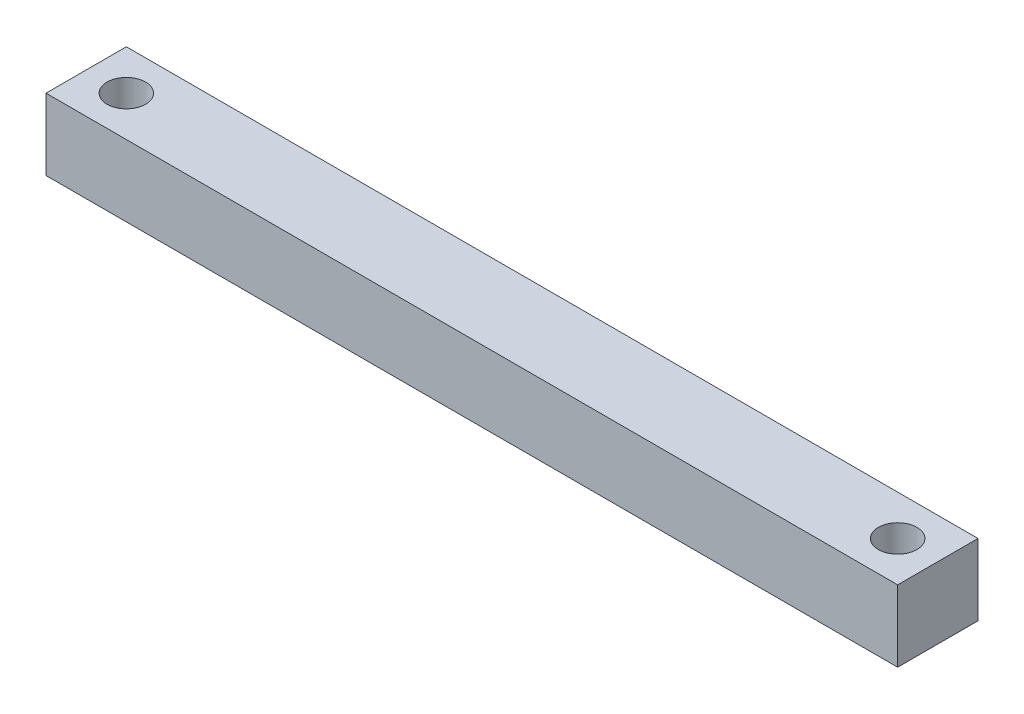
ISO-10303-21;
HEADER;
FILE_DESCRIPTION(('STEP AP214'),'2;1');
FILE_NAME('part.step','',(''),(''),'','','');
FILE_SCHEMA(('AUTOMOTIVE_DESIGN { 1 0 10303 214 1 1 1 1 }'));
ENDSEC;
DATA;
#1=APPLICATION_CONTEXT('core data for automotive mechanical design processes');
#2=APPLICATION_PROTOCOL_DEFINITION('international standard','automotive_design',2000,#1);
#3=PRODUCT_CONTEXT('',#1,'mechanical');
#4=PRODUCT('Part','Part','',(#3));
#5=PRODUCT_RELATED_PRODUCT_CATEGORY('part','',(#4));
#6=PRODUCT_DEFINITION_FORMATION('','',#4);
#7=PRODUCT_DEFINITION_CONTEXT('part definition',#1,'design');
#8=PRODUCT_DEFINITION('design','',#6,#7);
#9=PRODUCT_DEFINITION_SHAPE('','',#8);
#10=(LENGTH_UNIT() NAMED_UNIT(*) SI_UNIT(.MILLI.,.METRE.));
#11=(NAMED_UNIT(*) PLANE_ANGLE_UNIT() SI_UNIT($,.RADIAN.));
#12=(NAMED_UNIT(*) SI_UNIT($,.STERADIAN.) SOLID_ANGLE_UNIT());
#13=UNCERTAINTY_MEASURE_WITH_UNIT(LENGTH_MEASURE(1.E-05),#10,'distance_accuracy_value','');
#14=(GEOMETRIC_REPRESENTATION_CONTEXT(3) GLOBAL_UNCERTAINTY_ASSIGNED_CONTEXT((#13)) GLOBAL_UNIT_ASSIGNED_CONTEXT((#10,
#11,#12)) REPRESENTATION_CONTEXT('',''));
#15=CARTESIAN_POINT('',(0.,0.,0.));
#16=DIRECTION('',(0.,0.,1.));
#17=DIRECTION('',(1.,0.,0.));
#18=AXIS2_PLACEMENT_3D('',#15,#16,#17);
#19=CARTESIAN_POINT('',(0.,0.,0.));
#20=DIRECTION('',(0.,-1.,0.));
#21=DIRECTION('',(0.,0.,-1.));
#22=AXIS2_PLACEMENT_3D('',#19,#20,#21);
#23=PLANE('',#22);
#24=DIRECTION('',(-1.,0.,0.));
#25=VECTOR('',#24,1.);
#26=CARTESIAN_POINT('',(0.,0.,-31.75));
#27=LINE('',#26,#25);
#28=CARTESIAN_POINT('',(152.4,0.,-31.75));
#29=VERTEX_POINT('',#28);
#30=CARTESIAN_POINT('',(15.875,0.,-31.75));
#31=VERTEX_POINT('',#30);
#32=EDGE_CURVE('E196',#29,#31,#27,.T.);
#33=ORIENTED_EDGE('',*,*,#32,.F.);
#34=DIRECTION('',(0.,0.,1.));
#35=VECTOR('',#34,1.);
#36=CARTESIAN_POINT('',(152.4,0.,0.));
#37=LINE('',#36,#35);
#38=CARTESIAN_POINT('',(152.4,0.,0.));
#39=VERTEX_POINT('',#38);
#40=EDGE_CURVE('E11',#29,#39,#37,.T.);
#41=ORIENTED_EDGE('',*,*,#40,.T.);
#42=DIRECTION('',(1.,0.,0.));
#43=VECTOR('',#42,1.);
#44=CARTESIAN_POINT('',(0.,0.,0.));
#45=LINE('',#44,#43);
#46=CARTESIAN_POINT('',(15.875,0.,0.));
#47=VERTEX_POINT('',#46);
#48=EDGE_CURVE('E213',#47,#39,#45,.T.);
#49=ORIENTED_EDGE('',*,*,#48,.F.);
#50=CARTESIAN_POINT('',(15.875,0.,-15.875));
#51=DIRECTION('',(0.,-1.,0.));
#52=DIRECTION('',(0.,0.,-1.));
#53=AXIS2_PLACEMENT_3D('',#50,#51,#52);
#54=CIRCLE('',#53,15.875);
#55=EDGE_CURVE('E141',#47,#31,#54,.F.);
#56=ORIENTED_EDGE('',*,*,#55,.T.);
#57=EDGE_LOOP('',(#33,#41,#49,#56));
#58=FACE_BOUND('',#57,.T.);
#59=ADVANCED_FACE('F46',(#58),#23,.T.);
#60=CARTESIAN_POINT('',(184.15,0.,0.));
#61=VERTEX_POINT('',#60);
#62=CARTESIAN_POINT('',(320.675,0.,0.));
#63=VERTEX_POINT('',#62);
#64=EDGE_CURVE('E215',#61,#63,#45,.T.);
#65=ORIENTED_EDGE('',*,*,#64,.F.);
#66=DIRECTION('',(0.,0.,-1.));
#67=VECTOR('',#66,1.);
#68=CARTESIAN_POINT('',(184.15,0.,0.));
#69=LINE('',#68,#67);
#70=CARTESIAN_POINT('',(184.15,0.,-31.75));
#71=VERTEX_POINT('',#70);
#72=EDGE_CURVE('E54',#61,#71,#69,.T.);
#73=ORIENTED_EDGE('',*,*,#72,.T.);
#74=CARTESIAN_POINT('',(320.675,0.,-31.75));
#75=VERTEX_POINT('',#74);
#76=EDGE_CURVE('E199',#75,#71,#27,.T.);
#77=ORIENTED_EDGE('',*,*,#76,.F.);
#78=CARTESIAN_POINT('',(320.675,0.,-15.875));
#79=DIRECTION('',(0.,-1.,0.));
#80=DIRECTION('',(0.,0.,-1.));
#81=AXIS2_PLACEMENT_3D('',#78,#79,#80);
#82=CIRCLE('',#81,15.875);
#83=EDGE_CURVE('E158',#75,#63,#82,.F.);
#84=ORIENTED_EDGE('',*,*,#83,.T.);
#85=EDGE_LOOP('',(#65,#73,#77,#84));
#86=FACE_BOUND('',#85,.T.);
#87=ADVANCED_FACE('F250',(#86),#23,.T.);
#88=ORIENTED_EDGE('',*,*,#40,.F.);
#89=EDGE_CURVE('E361',#71,#29,#27,.T.);
#90=ORIENTED_EDGE('',*,*,#89,.F.);
#91=ORIENTED_EDGE('',*,*,#72,.F.);
#92=EDGE_CURVE('E212',#39,#61,#45,.T.);
#93=ORIENTED_EDGE('',*,*,#92,.F.);
#94=EDGE_LOOP('',(#88,#90,#91,#93));
#95=FACE_BOUND('',#94,.T.);
#96=ADVANCED_FACE('F252',(#95),#23,.T.);
#97=CARTESIAN_POINT('',(336.55,0.,0.));
#98=VERTEX_POINT('',#97);
#99=EDGE_CURVE('E182',#63,#98,#45,.T.);
#100=ORIENTED_EDGE('',*,*,#99,.F.);
#101=CARTESIAN_POINT('',(336.55,0.,-15.875));
#102=VERTEX_POINT('',#101);
#103=EDGE_CURVE('E160',#63,#102,#82,.F.);
#104=ORIENTED_EDGE('',*,*,#103,.T.);
#105=DIRECTION('',(0.,0.,-1.));
#106=VECTOR('',#105,1.);
#107=CARTESIAN_POINT('',(336.55,0.,0.));
#108=LINE('',#107,#106);
#109=EDGE_CURVE('E177',#98,#102,#108,.T.);
#110=ORIENTED_EDGE('',*,*,#109,.F.);
#111=EDGE_LOOP('',(#100,#104,#110));
#112=FACE_BOUND('',#111,.T.);
#113=ADVANCED_FACE('F180',(#112),#23,.T.);
#114=CARTESIAN_POINT('',(336.55,0.,-31.75));
#115=VERTEX_POINT('',#114);
#116=EDGE_CURVE('E190',#102,#115,#108,.T.);
#117=ORIENTED_EDGE('',*,*,#116,.F.);
#118=EDGE_CURVE('E152',#102,#75,#82,.F.);
#119=ORIENTED_EDGE('',*,*,#118,.T.);
#120=EDGE_CURVE('E140',#115,#75,#27,.T.);
#121=ORIENTED_EDGE('',*,*,#120,.F.);
#122=EDGE_LOOP('',(#117,#119,#121));
#123=FACE_BOUND('',#122,.T.);
#124=ADVANCED_FACE('F188',(#123),#23,.T.);
#125=CARTESIAN_POINT('',(0.,0.,-31.75));
#126=VERTEX_POINT('',#125);
#127=EDGE_CURVE('E197',#31,#126,#27,.T.);
#128=ORIENTED_EDGE('',*,*,#127,.F.);
#129=CARTESIAN_POINT('',(0.,0.,-15.875));
#130=VERTEX_POINT('',#129);
#131=EDGE_CURVE('E149',#31,#130,#54,.F.);
#132=ORIENTED_EDGE('',*,*,#131,.T.);
#133=DIRECTION('',(0.,0.,1.));
#134=VECTOR('',#133,1.);
#135=CARTESIAN_POINT('',(0.,0.,0.));
#136=LINE('',#135,#134);
#137=EDGE_CURVE('E209',#126,#130,#136,.T.);
#138=ORIENTED_EDGE('',*,*,#137,.F.);
#139=EDGE_LOOP('',(#128,#132,#138));
#140=FACE_BOUND('',#139,.T.);
#141=ADVANCED_FACE('F311',(#140),#23,.T.);
#142=CARTESIAN_POINT('',(0.,0.,0.));
#143=VERTEX_POINT('',#142);
#144=EDGE_CURVE('E143',#130,#143,#136,.T.);
#145=ORIENTED_EDGE('',*,*,#144,.F.);
#146=EDGE_CURVE('E150',#130,#47,#54,.F.);
#147=ORIENTED_EDGE('',*,*,#146,.T.);
#148=EDGE_CURVE('E191',#143,#47,#45,.T.);
#149=ORIENTED_EDGE('',*,*,#148,.F.);
#150=EDGE_LOOP('',(#145,#147,#149));
#151=FACE_BOUND('',#150,.T.);
#152=ADVANCED_FACE('F243',(#151),#23,.T.);
#153=ORIENTED_EDGE('',*,*,#83,.F.);
#154=ORIENTED_EDGE('',*,*,#118,.F.);
#155=ORIENTED_EDGE('',*,*,#103,.F.);
#156=EDGE_LOOP('',(#153,#154,#155));
#157=FACE_BOUND('',#156,.T.);
#158=CARTESIAN_POINT('',(320.675,0.,-15.875));
#159=DIRECTION('',(0.,1.,0.));
#160=DIRECTION('',(0.,0.,1.));
#161=AXIS2_PLACEMENT_3D('',#158,#159,#160);
#162=CIRCLE('',#161,7.62000000000003);
#163=CARTESIAN_POINT('',(320.675,0.,-8.25499999999997));
#164=VERTEX_POINT('',#163);
#165=EDGE_CURVE('E223',#164,#164,#162,.T.);
#166=ORIENTED_EDGE('',*,*,#165,.T.);
#167=EDGE_LOOP('',(#166));
#168=FACE_BOUND('',#167,.T.);
#169=ADVANCED_FACE('F184',(#157,#168),#23,.T.);
#170=CARTESIAN_POINT('',(0.,28.194,0.));
#171=DIRECTION('',(0.,-1.,0.));
#172=DIRECTION('',(0.,0.,-1.));
#173=AXIS2_PLACEMENT_3D('',#170,#171,#172);
#174=PLANE('',#173);
#175=DIRECTION('',(0.,0.,1.));
#176=VECTOR('',#175,1.);
#177=CARTESIAN_POINT('',(0.,28.194,0.));
#178=LINE('',#177,#176);
#179=CARTESIAN_POINT('',(0.,28.194,-31.75));
#180=VERTEX_POINT('',#179);
#181=CARTESIAN_POINT('',(0.,28.194,0.));
#182=VERTEX_POINT('',#181);
#183=EDGE_CURVE('E130',#180,#182,#178,.T.);
#184=ORIENTED_EDGE('',*,*,#183,.T.);
#185=DIRECTION('',(1.,0.,0.));
#186=VECTOR('',#185,1.);
#187=CARTESIAN_POINT('',(0.,28.194,0.));
#188=LINE('',#187,#186);
#189=CARTESIAN_POINT('',(336.55,28.194,0.));
#190=VERTEX_POINT('',#189);
#191=EDGE_CURVE('E119',#182,#190,#188,.T.);
#192=ORIENTED_EDGE('',*,*,#191,.T.);
#193=DIRECTION('',(0.,0.,-1.));
#194=VECTOR('',#193,1.);
#195=CARTESIAN_POINT('',(336.55,28.194,0.));
#196=LINE('',#195,#194);
#197=CARTESIAN_POINT('',(336.55,28.194,-31.75));
#198=VERTEX_POINT('',#197);
#199=EDGE_CURVE('E127',#190,#198,#196,.T.);
#200=ORIENTED_EDGE('',*,*,#199,.T.);
#201=DIRECTION('',(-1.,0.,0.));
#202=VECTOR('',#201,1.);
#203=CARTESIAN_POINT('',(0.,28.194,-31.75));
#204=LINE('',#203,#202);
#205=EDGE_CURVE('E135',#198,#180,#204,.T.);
#206=ORIENTED_EDGE('',*,*,#205,.T.);
#207=EDGE_LOOP('',(#184,#192,#200,#206));
#208=FACE_BOUND('',#207,.T.);
#209=CARTESIAN_POINT('',(15.875,28.194,-15.875));
#210=DIRECTION('',(0.,1.,0.));
#211=DIRECTION('',(0.,0.,1.));
#212=AXIS2_PLACEMENT_3D('',#209,#210,#211);
#213=CIRCLE('',#212,7.62);
#214=CARTESIAN_POINT('',(15.875,28.194,-8.255));
#215=VERTEX_POINT('',#214);
#216=EDGE_CURVE('E214',#215,#215,#213,.T.);
#217=ORIENTED_EDGE('',*,*,#216,.F.);
#218=EDGE_LOOP('',(#217));
#219=FACE_BOUND('',#218,.T.);
#220=CARTESIAN_POINT('',(320.675,28.194,-15.875));
#221=DIRECTION('',(0.,1.,0.));
#222=DIRECTION('',(0.,0.,1.));
#223=AXIS2_PLACEMENT_3D('',#220,#221,#222);
#224=CIRCLE('',#223,7.62000000000003);
#225=CARTESIAN_POINT('',(320.675,28.194,-8.25499999999997));
#226=VERTEX_POINT('',#225);
#227=EDGE_CURVE('E225',#226,#226,#224,.T.);
#228=ORIENTED_EDGE('',*,*,#227,.F.);
#229=EDGE_LOOP('',(#228));
#230=FACE_BOUND('',#229,.T.);
#231=ADVANCED_FACE('F128',(#208,#219,#230),#174,.F.);
#232=ORIENTED_EDGE('',*,*,#131,.F.);
#233=ORIENTED_EDGE('',*,*,#55,.F.);
#234=ORIENTED_EDGE('',*,*,#146,.F.);
#235=EDGE_LOOP('',(#232,#233,#234));
#236=FACE_BOUND('',#235,.T.);
#237=CARTESIAN_POINT('',(15.875,0.,-15.875));
#238=DIRECTION('',(0.,1.,0.));
#239=DIRECTION('',(0.,0.,1.));
#240=AXIS2_PLACEMENT_3D('',#237,#238,#239);
#241=CIRCLE('',#240,7.62);
#242=CARTESIAN_POINT('',(15.875,0.,-8.255));
#243=VERTEX_POINT('',#242);
#244=EDGE_CURVE('E220',#243,#243,#241,.T.);
#245=ORIENTED_EDGE('',*,*,#244,.T.);
#246=EDGE_LOOP('',(#245));
#247=FACE_BOUND('',#246,.T.);
#248=ADVANCED_FACE('F232',(#236,#247),#23,.T.);
#249=CARTESIAN_POINT('',(0.,28.194,0.));
#250=DIRECTION('',(1.,0.,0.));
#251=DIRECTION('',(0.,0.,-1.));
#252=AXIS2_PLACEMENT_3D('',#249,#250,#251);
#253=PLANE('',#252);
#254=ORIENTED_EDGE('',*,*,#137,.T.);
#255=ORIENTED_EDGE('',*,*,#144,.T.);
#256=DIRECTION('',(0.,-1.,0.));
#257=VECTOR('',#256,1.);
#258=CARTESIAN_POINT('',(0.,28.194,0.));
#259=LINE('',#258,#257);
#260=EDGE_CURVE('E124',#182,#143,#259,.T.);
#261=ORIENTED_EDGE('',*,*,#260,.F.);
#262=ORIENTED_EDGE('',*,*,#183,.F.);
#263=DIRECTION('',(0.,-1.,0.));
#264=VECTOR('',#263,1.);
#265=CARTESIAN_POINT('',(0.,28.194,-31.75));
#266=LINE('',#265,#264);
#267=EDGE_CURVE('E204',#180,#126,#266,.T.);
#268=ORIENTED_EDGE('',*,*,#267,.T.);
#269=EDGE_LOOP('',(#254,#255,#261,#262,#268));
#270=FACE_BOUND('',#269,.T.);
#271=ADVANCED_FACE('F48',(#270),#253,.F.);
#272=CARTESIAN_POINT('',(0.,28.194,0.));
#273=DIRECTION('',(0.,0.,-1.));
#274=DIRECTION('',(-1.,0.,0.));
#275=AXIS2_PLACEMENT_3D('',#272,#273,#274);
#276=PLANE('',#275);
#277=ORIENTED_EDGE('',*,*,#148,.T.);
#278=ORIENTED_EDGE('',*,*,#48,.T.);
#279=ORIENTED_EDGE('',*,*,#92,.T.);
#280=ORIENTED_EDGE('',*,*,#64,.T.);
#281=ORIENTED_EDGE('',*,*,#99,.T.);
#282=DIRECTION('',(0.,-1.,0.));
#283=VECTOR('',#282,1.);
#284=CARTESIAN_POINT('',(336.55,28.194,0.));
#285=LINE('',#284,#283);
#286=EDGE_CURVE('E125',#190,#98,#285,.T.);
#287=ORIENTED_EDGE('',*,*,#286,.F.);
#288=ORIENTED_EDGE('',*,*,#191,.F.);
#289=ORIENTED_EDGE('',*,*,#260,.T.);
#290=EDGE_LOOP('',(#277,#278,#279,#280,#281,#287,#288,#289));
#291=FACE_BOUND('',#290,.T.);
#292=ADVANCED_FACE('F118',(#291),#276,.F.);
#293=CARTESIAN_POINT('',(336.55,28.194,0.));
#294=DIRECTION('',(-1.,0.,0.));
#295=DIRECTION('',(0.,0.,1.));
#296=AXIS2_PLACEMENT_3D('',#293,#294,#295);
#297=PLANE('',#296);
#298=ORIENTED_EDGE('',*,*,#109,.T.);
#299=ORIENTED_EDGE('',*,*,#116,.T.);
#300=DIRECTION('',(0.,-1.,0.));
#301=VECTOR('',#300,1.);
#302=CARTESIAN_POINT('',(336.55,28.194,-31.75));
#303=LINE('',#302,#301);
#304=EDGE_CURVE('E147',#198,#115,#303,.T.);
#305=ORIENTED_EDGE('',*,*,#304,.F.);
#306=ORIENTED_EDGE('',*,*,#199,.F.);
#307=ORIENTED_EDGE('',*,*,#286,.T.);
#308=EDGE_LOOP('',(#298,#299,#305,#306,#307));
#309=FACE_BOUND('',#308,.T.);
#310=ADVANCED_FACE('F198',(#309),#297,.F.);
#311=CARTESIAN_POINT('',(0.,28.194,-31.75));
#312=DIRECTION('',(0.,0.,1.));
#313=DIRECTION('',(1.,0.,0.));
#314=AXIS2_PLACEMENT_3D('',#311,#312,#313);
#315=PLANE('',#314);
#316=ORIENTED_EDGE('',*,*,#120,.T.);
#317=ORIENTED_EDGE('',*,*,#76,.T.);
#318=ORIENTED_EDGE('',*,*,#89,.T.);
#319=ORIENTED_EDGE('',*,*,#32,.T.);
#320=ORIENTED_EDGE('',*,*,#127,.T.);
#321=ORIENTED_EDGE('',*,*,#267,.F.);
#322=ORIENTED_EDGE('',*,*,#205,.F.);
#323=ORIENTED_EDGE('',*,*,#304,.T.);
#324=EDGE_LOOP('',(#316,#317,#318,#319,#320,#321,#322,#323));
#325=FACE_BOUND('',#324,.T.);
#326=ADVANCED_FACE('F206',(#325),#315,.F.);
#327=CARTESIAN_POINT('',(15.875,28.194,-15.875));
#328=DIRECTION('',(0.,-1.,0.));
#329=DIRECTION('',(0.,0.,-1.));
#330=AXIS2_PLACEMENT_3D('',#327,#328,#329);
#331=CYLINDRICAL_SURFACE('',#330,7.62);
#332=ORIENTED_EDGE('',*,*,#216,.T.);
#333=EDGE_LOOP('',(#332));
#334=FACE_BOUND('',#333,.T.);
#335=ORIENTED_EDGE('',*,*,#244,.F.);
#336=EDGE_LOOP('',(#335));
#337=FACE_BOUND('',#336,.T.);
#338=ADVANCED_FACE('F258',(#334,#337),#331,.F.);
#339=CARTESIAN_POINT('',(320.675,28.194,-15.875));
#340=DIRECTION('',(0.,-1.,0.));
#341=DIRECTION('',(0.,0.,-1.));
#342=AXIS2_PLACEMENT_3D('',#339,#340,#341);
#343=CYLINDRICAL_SURFACE('',#342,7.62000000000003);
#344=ORIENTED_EDGE('',*,*,#227,.T.);
#345=EDGE_LOOP('',(#344));
#346=FACE_BOUND('',#345,.T.);
#347=ORIENTED_EDGE('',*,*,#165,.F.);
#348=EDGE_LOOP('',(#347));
#349=FACE_BOUND('',#348,.T.);
#350=ADVANCED_FACE('F234',(#346,#349),#343,.F.);
#351=CLOSED_SHELL('',(#59,#87,#96,#113,#124,#141,#152,#169,#231,#248,#271,#292,#310,#326,#338,#350));
#352=MANIFOLD_SOLID_BREP('B2',#351);
#353=ADVANCED_BREP_SHAPE_REPRESENTATION('',(#18,#352),#14);
#354=SHAPE_DEFINITION_REPRESENTATION(#9,#353);
ENDSEC;
END-ISO-10303-21;
